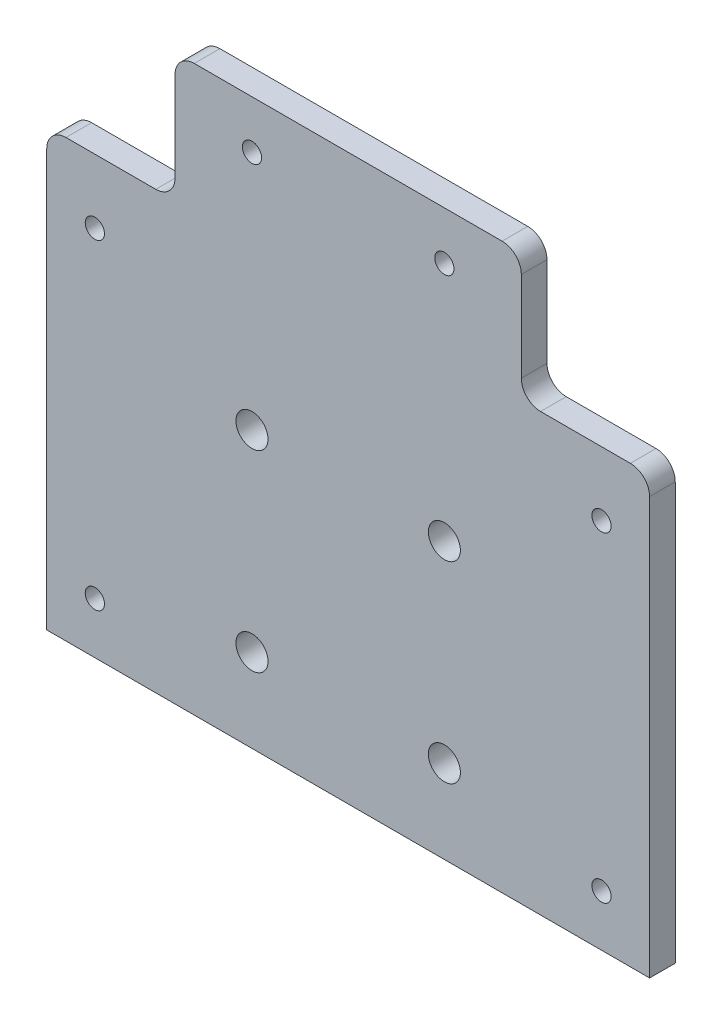
ISO-10303-21;
HEADER;
FILE_DESCRIPTION(('STEP AP214'),'2;1');
FILE_NAME('part.step','',(''),(''),'','','');
FILE_SCHEMA(('AUTOMOTIVE_DESIGN { 1 0 10303 214 1 1 1 1 }'));
ENDSEC;
DATA;
#1=APPLICATION_CONTEXT('core data for automotive mechanical design processes');
#2=APPLICATION_PROTOCOL_DEFINITION('international standard','automotive_design',2000,#1);
#3=PRODUCT_CONTEXT('',#1,'mechanical');
#4=PRODUCT('Part','Part','',(#3));
#5=PRODUCT_RELATED_PRODUCT_CATEGORY('part','',(#4));
#6=PRODUCT_DEFINITION_FORMATION('','',#4);
#7=PRODUCT_DEFINITION_CONTEXT('part definition',#1,'design');
#8=PRODUCT_DEFINITION('design','',#6,#7);
#9=PRODUCT_DEFINITION_SHAPE('','',#8);
#10=(LENGTH_UNIT() NAMED_UNIT(*) SI_UNIT(.MILLI.,.METRE.));
#11=(NAMED_UNIT(*) PLANE_ANGLE_UNIT() SI_UNIT($,.RADIAN.));
#12=(NAMED_UNIT(*) SI_UNIT($,.STERADIAN.) SOLID_ANGLE_UNIT());
#13=UNCERTAINTY_MEASURE_WITH_UNIT(LENGTH_MEASURE(1.E-05),#10,'distance_accuracy_value','');
#14=(GEOMETRIC_REPRESENTATION_CONTEXT(3) GLOBAL_UNCERTAINTY_ASSIGNED_CONTEXT((#13)) GLOBAL_UNIT_ASSIGNED_CONTEXT((#10,
#11,#12)) REPRESENTATION_CONTEXT('',''));
#15=CARTESIAN_POINT('',(0.,0.,0.));
#16=DIRECTION('',(0.,0.,1.));
#17=DIRECTION('',(1.,0.,0.));
#18=AXIS2_PLACEMENT_3D('',#15,#16,#17);
#19=CARTESIAN_POINT('',(47.,44.,4.));
#20=DIRECTION('',(-1.,0.,0.));
#21=DIRECTION('',(0.,-1.,0.));
#22=AXIS2_PLACEMENT_3D('',#19,#20,#21);
#23=PLANE('',#22);
#24=DIRECTION('',(0.,1.,0.));
#25=VECTOR('',#24,1.);
#26=CARTESIAN_POINT('',(47.,44.,0.));
#27=LINE('',#26,#25);
#28=CARTESIAN_POINT('',(47.,-44.,0.));
#29=VERTEX_POINT('',#28);
#30=CARTESIAN_POINT('',(47.,21.,0.));
#31=VERTEX_POINT('',#30);
#32=EDGE_CURVE('E172',#29,#31,#27,.T.);
#33=ORIENTED_EDGE('',*,*,#32,.T.);
#34=DIRECTION('',(0.,0.,1.));
#35=VECTOR('',#34,1.);
#36=CARTESIAN_POINT('',(47.,21.,4.));
#37=LINE('',#36,#35);
#38=CARTESIAN_POINT('',(47.,21.,4.));
#39=VERTEX_POINT('',#38);
#40=EDGE_CURVE('E160',#31,#39,#37,.T.);
#41=ORIENTED_EDGE('',*,*,#40,.T.);
#42=DIRECTION('',(0.,1.,0.));
#43=VECTOR('',#42,1.);
#44=CARTESIAN_POINT('',(47.,44.,4.));
#45=LINE('',#44,#43);
#46=CARTESIAN_POINT('',(47.,-44.,4.));
#47=VERTEX_POINT('',#46);
#48=EDGE_CURVE('E185',#47,#39,#45,.T.);
#49=ORIENTED_EDGE('',*,*,#48,.F.);
#50=DIRECTION('',(0.,0.,-1.));
#51=VECTOR('',#50,1.);
#52=CARTESIAN_POINT('',(47.,-44.,4.));
#53=LINE('',#52,#51);
#54=EDGE_CURVE('E161',#47,#29,#53,.T.);
#55=ORIENTED_EDGE('',*,*,#54,.T.);
#56=EDGE_LOOP('',(#33,#41,#49,#55));
#57=FACE_BOUND('',#56,.T.);
#58=ADVANCED_FACE('F39',(#57),#23,.F.);
#59=CARTESIAN_POINT('',(-47.,44.,4.));
#60=DIRECTION('',(0.,-1.,0.));
#61=DIRECTION('',(0.,0.,-1.));
#62=AXIS2_PLACEMENT_3D('',#59,#60,#61);
#63=PLANE('',#62);
#64=DIRECTION('',(-1.,0.,0.));
#65=VECTOR('',#64,1.);
#66=CARTESIAN_POINT('',(-47.,44.,0.));
#67=LINE('',#66,#65);
#68=CARTESIAN_POINT('',(24.,44.,0.));
#69=VERTEX_POINT('',#68);
#70=CARTESIAN_POINT('',(-24.,44.,0.));
#71=VERTEX_POINT('',#70);
#72=EDGE_CURVE('E176',#69,#71,#67,.T.);
#73=ORIENTED_EDGE('',*,*,#72,.T.);
#74=DIRECTION('',(0.,0.,1.));
#75=VECTOR('',#74,1.);
#76=CARTESIAN_POINT('',(-24.,44.,4.));
#77=LINE('',#76,#75);
#78=CARTESIAN_POINT('',(-24.,44.,4.));
#79=VERTEX_POINT('',#78);
#80=EDGE_CURVE('E232',#71,#79,#77,.T.);
#81=ORIENTED_EDGE('',*,*,#80,.T.);
#82=DIRECTION('',(-1.,0.,0.));
#83=VECTOR('',#82,1.);
#84=CARTESIAN_POINT('',(-47.,44.,4.));
#85=LINE('',#84,#83);
#86=CARTESIAN_POINT('',(24.,44.,4.));
#87=VERTEX_POINT('',#86);
#88=EDGE_CURVE('E151',#87,#79,#85,.T.);
#89=ORIENTED_EDGE('',*,*,#88,.F.);
#90=DIRECTION('',(0.,0.,1.));
#91=VECTOR('',#90,1.);
#92=CARTESIAN_POINT('',(24.,44.,4.));
#93=LINE('',#92,#91);
#94=EDGE_CURVE('E229',#87,#69,#93,.F.);
#95=ORIENTED_EDGE('',*,*,#94,.T.);
#96=EDGE_LOOP('',(#73,#81,#89,#95));
#97=FACE_BOUND('',#96,.T.);
#98=ADVANCED_FACE('F310',(#97),#63,.F.);
#99=CARTESIAN_POINT('',(-47.,44.,4.));
#100=DIRECTION('',(1.,0.,0.));
#101=DIRECTION('',(0.,1.,0.));
#102=AXIS2_PLACEMENT_3D('',#99,#100,#101);
#103=PLANE('',#102);
#104=DIRECTION('',(0.,-1.,0.));
#105=VECTOR('',#104,1.);
#106=CARTESIAN_POINT('',(-47.,44.,4.));
#107=LINE('',#106,#105);
#108=CARTESIAN_POINT('',(-47.,21.,4.));
#109=VERTEX_POINT('',#108);
#110=CARTESIAN_POINT('',(-47.,-44.,4.));
#111=VERTEX_POINT('',#110);
#112=EDGE_CURVE('E141',#109,#111,#107,.T.);
#113=ORIENTED_EDGE('',*,*,#112,.F.);
#114=DIRECTION('',(0.,0.,1.));
#115=VECTOR('',#114,1.);
#116=CARTESIAN_POINT('',(-47.,21.,4.));
#117=LINE('',#116,#115);
#118=CARTESIAN_POINT('',(-47.,21.,0.));
#119=VERTEX_POINT('',#118);
#120=EDGE_CURVE('E55',#109,#119,#117,.F.);
#121=ORIENTED_EDGE('',*,*,#120,.T.);
#122=DIRECTION('',(0.,-1.,0.));
#123=VECTOR('',#122,1.);
#124=CARTESIAN_POINT('',(-47.,44.,0.));
#125=LINE('',#124,#123);
#126=CARTESIAN_POINT('',(-47.,-44.,0.));
#127=VERTEX_POINT('',#126);
#128=EDGE_CURVE('E156',#119,#127,#125,.T.);
#129=ORIENTED_EDGE('',*,*,#128,.T.);
#130=DIRECTION('',(0.,0.,-1.));
#131=VECTOR('',#130,1.);
#132=CARTESIAN_POINT('',(-47.,-44.,4.));
#133=LINE('',#132,#131);
#134=EDGE_CURVE('E154',#111,#127,#133,.T.);
#135=ORIENTED_EDGE('',*,*,#134,.F.);
#136=EDGE_LOOP('',(#113,#121,#129,#135));
#137=FACE_BOUND('',#136,.T.);
#138=ADVANCED_FACE('F155',(#137),#103,.F.);
#139=CARTESIAN_POINT('',(-47.,-44.,4.));
#140=DIRECTION('',(0.,1.,0.));
#141=DIRECTION('',(0.,0.,1.));
#142=AXIS2_PLACEMENT_3D('',#139,#140,#141);
#143=PLANE('',#142);
#144=DIRECTION('',(1.,0.,0.));
#145=VECTOR('',#144,1.);
#146=CARTESIAN_POINT('',(-47.,-44.,0.));
#147=LINE('',#146,#145);
#148=EDGE_CURVE('E183',#127,#29,#147,.T.);
#149=ORIENTED_EDGE('',*,*,#148,.T.);
#150=ORIENTED_EDGE('',*,*,#54,.F.);
#151=DIRECTION('',(1.,0.,0.));
#152=VECTOR('',#151,1.);
#153=CARTESIAN_POINT('',(-47.,-44.,4.));
#154=LINE('',#153,#152);
#155=EDGE_CURVE('E146',#111,#47,#154,.T.);
#156=ORIENTED_EDGE('',*,*,#155,.F.);
#157=ORIENTED_EDGE('',*,*,#134,.T.);
#158=EDGE_LOOP('',(#149,#150,#156,#157));
#159=FACE_BOUND('',#158,.T.);
#160=ADVANCED_FACE('F163',(#159),#143,.F.);
#161=CARTESIAN_POINT('',(0.,0.,4.));
#162=DIRECTION('',(0.,0.,1.));
#163=DIRECTION('',(1.,0.,0.));
#164=AXIS2_PLACEMENT_3D('',#161,#162,#163);
#165=PLANE('',#164);
#166=CARTESIAN_POINT('',(39.5,14.,4.));
#167=DIRECTION('',(0.,0.,1.));
#168=DIRECTION('',(1.,0.,0.));
#169=AXIS2_PLACEMENT_3D('',#166,#167,#168);
#170=CIRCLE('',#169,1.5);
#171=CARTESIAN_POINT('',(41.,14.,4.));
#172=VERTEX_POINT('',#171);
#173=EDGE_CURVE('E431',#172,#172,#170,.T.);
#174=ORIENTED_EDGE('',*,*,#173,.F.);
#175=EDGE_LOOP('',(#174));
#176=FACE_BOUND('',#175,.T.);
#177=CARTESIAN_POINT('',(39.5,-36.,4.));
#178=DIRECTION('',(0.,0.,1.));
#179=DIRECTION('',(1.,0.,0.));
#180=AXIS2_PLACEMENT_3D('',#177,#178,#179);
#181=CIRCLE('',#180,1.5);
#182=CARTESIAN_POINT('',(41.,-36.,4.));
#183=VERTEX_POINT('',#182);
#184=EDGE_CURVE('E439',#183,#183,#181,.T.);
#185=ORIENTED_EDGE('',*,*,#184,.F.);
#186=EDGE_LOOP('',(#185));
#187=FACE_BOUND('',#186,.T.);
#188=CARTESIAN_POINT('',(15.,36.5,4.));
#189=DIRECTION('',(0.,0.,1.));
#190=DIRECTION('',(-1.,0.,0.));
#191=AXIS2_PLACEMENT_3D('',#188,#189,#190);
#192=CIRCLE('',#191,1.5);
#193=CARTESIAN_POINT('',(13.5,36.5,4.));
#194=VERTEX_POINT('',#193);
#195=EDGE_CURVE('E447',#194,#194,#192,.T.);
#196=ORIENTED_EDGE('',*,*,#195,.F.);
#197=EDGE_LOOP('',(#196));
#198=FACE_BOUND('',#197,.T.);
#199=CARTESIAN_POINT('',(-39.5,-36.,4.));
#200=DIRECTION('',(0.,0.,1.));
#201=DIRECTION('',(-1.,0.,0.));
#202=AXIS2_PLACEMENT_3D('',#199,#200,#201);
#203=CIRCLE('',#202,1.5);
#204=CARTESIAN_POINT('',(-41.,-36.,4.));
#205=VERTEX_POINT('',#204);
#206=EDGE_CURVE('E423',#205,#205,#203,.T.);
#207=ORIENTED_EDGE('',*,*,#206,.F.);
#208=EDGE_LOOP('',(#207));
#209=FACE_BOUND('',#208,.T.);
#210=CARTESIAN_POINT('',(-39.5,14.,4.));
#211=DIRECTION('',(0.,0.,1.));
#212=DIRECTION('',(-1.,0.,0.));
#213=AXIS2_PLACEMENT_3D('',#210,#211,#212);
#214=CIRCLE('',#213,1.5);
#215=CARTESIAN_POINT('',(-41.,14.,4.));
#216=VERTEX_POINT('',#215);
#217=EDGE_CURVE('E418',#216,#216,#214,.T.);
#218=ORIENTED_EDGE('',*,*,#217,.F.);
#219=EDGE_LOOP('',(#218));
#220=FACE_BOUND('',#219,.T.);
#221=CARTESIAN_POINT('',(-15.,36.5,4.));
#222=DIRECTION('',(0.,0.,1.));
#223=DIRECTION('',(1.,0.,0.));
#224=AXIS2_PLACEMENT_3D('',#221,#222,#223);
#225=CIRCLE('',#224,1.5);
#226=CARTESIAN_POINT('',(-13.5,36.5,4.));
#227=VERTEX_POINT('',#226);
#228=EDGE_CURVE('E430',#227,#227,#225,.T.);
#229=ORIENTED_EDGE('',*,*,#228,.F.);
#230=EDGE_LOOP('',(#229));
#231=FACE_BOUND('',#230,.T.);
#232=CARTESIAN_POINT('',(-15.,-31.,4.));
#233=DIRECTION('',(0.,0.,1.));
#234=DIRECTION('',(1.,0.,0.));
#235=AXIS2_PLACEMENT_3D('',#232,#233,#234);
#236=CIRCLE('',#235,2.5);
#237=CARTESIAN_POINT('',(-12.5,-31.,4.));
#238=VERTEX_POINT('',#237);
#239=EDGE_CURVE('E462',#238,#238,#236,.T.);
#240=ORIENTED_EDGE('',*,*,#239,.F.);
#241=EDGE_LOOP('',(#240));
#242=FACE_BOUND('',#241,.T.);
#243=CARTESIAN_POINT('',(15.,-31.,4.));
#244=DIRECTION('',(0.,0.,1.));
#245=DIRECTION('',(1.,0.,0.));
#246=AXIS2_PLACEMENT_3D('',#243,#244,#245);
#247=CIRCLE('',#246,2.49999999999999);
#248=CARTESIAN_POINT('',(17.5,-31.,4.));
#249=VERTEX_POINT('',#248);
#250=EDGE_CURVE('E479',#249,#249,#247,.T.);
#251=ORIENTED_EDGE('',*,*,#250,.F.);
#252=EDGE_LOOP('',(#251));
#253=FACE_BOUND('',#252,.T.);
#254=CARTESIAN_POINT('',(15.,-1.00000000000001,4.));
#255=DIRECTION('',(0.,0.,1.));
#256=DIRECTION('',(1.,0.,0.));
#257=AXIS2_PLACEMENT_3D('',#254,#255,#256);
#258=CIRCLE('',#257,2.49999999999999);
#259=CARTESIAN_POINT('',(17.5,-1.00000000000001,4.));
#260=VERTEX_POINT('',#259);
#261=EDGE_CURVE('E471',#260,#260,#258,.T.);
#262=ORIENTED_EDGE('',*,*,#261,.F.);
#263=EDGE_LOOP('',(#262));
#264=FACE_BOUND('',#263,.T.);
#265=CARTESIAN_POINT('',(-15.,-1.00000000000001,4.));
#266=DIRECTION('',(0.,0.,1.));
#267=DIRECTION('',(1.,0.,0.));
#268=AXIS2_PLACEMENT_3D('',#265,#266,#267);
#269=CIRCLE('',#268,2.5);
#270=CARTESIAN_POINT('',(-12.5,-1.00000000000001,4.));
#271=VERTEX_POINT('',#270);
#272=EDGE_CURVE('E470',#271,#271,#269,.T.);
#273=ORIENTED_EDGE('',*,*,#272,.F.);
#274=EDGE_LOOP('',(#273));
#275=FACE_BOUND('',#274,.T.);
#276=ORIENTED_EDGE('',*,*,#48,.T.);
#277=CARTESIAN_POINT('',(44.,21.,4.));
#278=DIRECTION('',(0.,0.,1.));
#279=DIRECTION('',(1.,0.,0.));
#280=AXIS2_PLACEMENT_3D('',#277,#278,#279);
#281=CIRCLE('',#280,3.);
#282=CARTESIAN_POINT('',(44.,24.,4.));
#283=VERTEX_POINT('',#282);
#284=EDGE_CURVE('E198',#39,#283,#281,.T.);
#285=ORIENTED_EDGE('',*,*,#284,.T.);
#286=DIRECTION('',(1.,0.,0.));
#287=VECTOR('',#286,1.);
#288=CARTESIAN_POINT('',(47.,24.,4.));
#289=LINE('',#288,#287);
#290=CARTESIAN_POINT('',(30.,24.,4.));
#291=VERTEX_POINT('',#290);
#292=EDGE_CURVE('E293',#291,#283,#289,.T.);
#293=ORIENTED_EDGE('',*,*,#292,.F.);
#294=CARTESIAN_POINT('',(30.,27.,4.));
#295=DIRECTION('',(0.,0.,1.));
#296=DIRECTION('',(1.,0.,0.));
#297=AXIS2_PLACEMENT_3D('',#294,#295,#296);
#298=CIRCLE('',#297,3.);
#299=CARTESIAN_POINT('',(27.,27.,4.));
#300=VERTEX_POINT('',#299);
#301=EDGE_CURVE('E249',#291,#300,#298,.F.);
#302=ORIENTED_EDGE('',*,*,#301,.T.);
#303=DIRECTION('',(0.,-1.,0.));
#304=VECTOR('',#303,1.);
#305=CARTESIAN_POINT('',(27.,44.,4.));
#306=LINE('',#305,#304);
#307=CARTESIAN_POINT('',(27.,41.,4.));
#308=VERTEX_POINT('',#307);
#309=EDGE_CURVE('E296',#308,#300,#306,.T.);
#310=ORIENTED_EDGE('',*,*,#309,.F.);
#311=CARTESIAN_POINT('',(24.,41.,4.));
#312=DIRECTION('',(0.,0.,1.));
#313=DIRECTION('',(1.,0.,0.));
#314=AXIS2_PLACEMENT_3D('',#311,#312,#313);
#315=CIRCLE('',#314,3.);
#316=EDGE_CURVE('E190',#308,#87,#315,.T.);
#317=ORIENTED_EDGE('',*,*,#316,.T.);
#318=ORIENTED_EDGE('',*,*,#88,.T.);
#319=CARTESIAN_POINT('',(-24.,41.,4.));
#320=DIRECTION('',(0.,0.,1.));
#321=DIRECTION('',(1.,0.,0.));
#322=AXIS2_PLACEMENT_3D('',#319,#320,#321);
#323=CIRCLE('',#322,3.);
#324=CARTESIAN_POINT('',(-27.,41.,4.));
#325=VERTEX_POINT('',#324);
#326=EDGE_CURVE('E193',#79,#325,#323,.T.);
#327=ORIENTED_EDGE('',*,*,#326,.T.);
#328=DIRECTION('',(0.,1.,0.));
#329=VECTOR('',#328,1.);
#330=CARTESIAN_POINT('',(-27.,44.,4.));
#331=LINE('',#330,#329);
#332=CARTESIAN_POINT('',(-27.,27.,4.));
#333=VERTEX_POINT('',#332);
#334=EDGE_CURVE('E259',#333,#325,#331,.T.);
#335=ORIENTED_EDGE('',*,*,#334,.F.);
#336=CARTESIAN_POINT('',(-30.,27.,4.));
#337=DIRECTION('',(0.,0.,1.));
#338=DIRECTION('',(1.,0.,0.));
#339=AXIS2_PLACEMENT_3D('',#336,#337,#338);
#340=CIRCLE('',#339,3.);
#341=CARTESIAN_POINT('',(-30.,24.,4.));
#342=VERTEX_POINT('',#341);
#343=EDGE_CURVE('E48',#333,#342,#340,.F.);
#344=ORIENTED_EDGE('',*,*,#343,.T.);
#345=DIRECTION('',(1.,0.,0.));
#346=VECTOR('',#345,1.);
#347=CARTESIAN_POINT('',(-47.,24.,4.));
#348=LINE('',#347,#346);
#349=CARTESIAN_POINT('',(-44.,24.,4.));
#350=VERTEX_POINT('',#349);
#351=EDGE_CURVE('E257',#350,#342,#348,.T.);
#352=ORIENTED_EDGE('',*,*,#351,.F.);
#353=CARTESIAN_POINT('',(-44.,21.,4.));
#354=DIRECTION('',(0.,0.,1.));
#355=DIRECTION('',(1.,0.,0.));
#356=AXIS2_PLACEMENT_3D('',#353,#354,#355);
#357=CIRCLE('',#356,3.);
#358=EDGE_CURVE('E149',#350,#109,#357,.T.);
#359=ORIENTED_EDGE('',*,*,#358,.T.);
#360=ORIENTED_EDGE('',*,*,#112,.T.);
#361=ORIENTED_EDGE('',*,*,#155,.T.);
#362=EDGE_LOOP('',(#276,#285,#293,#302,#310,#317,#318,#327,#335,#344,#352,#359,#360,#361));
#363=FACE_BOUND('',#362,.T.);
#364=ADVANCED_FACE('F144',(#176,#187,#198,#209,#220,#231,#242,#253,#264,#275,#363),#165,.T.);
#365=CARTESIAN_POINT('',(0.,0.,0.));
#366=DIRECTION('',(0.,0.,1.));
#367=DIRECTION('',(1.,0.,0.));
#368=AXIS2_PLACEMENT_3D('',#365,#366,#367);
#369=PLANE('',#368);
#370=CARTESIAN_POINT('',(39.5,14.,0.));
#371=DIRECTION('',(0.,0.,1.));
#372=DIRECTION('',(1.,0.,0.));
#373=AXIS2_PLACEMENT_3D('',#370,#371,#372);
#374=CIRCLE('',#373,1.5);
#375=CARTESIAN_POINT('',(41.,14.,0.));
#376=VERTEX_POINT('',#375);
#377=EDGE_CURVE('E426',#376,#376,#374,.T.);
#378=ORIENTED_EDGE('',*,*,#377,.T.);
#379=EDGE_LOOP('',(#378));
#380=FACE_BOUND('',#379,.T.);
#381=CARTESIAN_POINT('',(39.5,-36.,0.));
#382=DIRECTION('',(0.,0.,1.));
#383=DIRECTION('',(1.,0.,0.));
#384=AXIS2_PLACEMENT_3D('',#381,#382,#383);
#385=CIRCLE('',#384,1.5);
#386=CARTESIAN_POINT('',(41.,-36.,0.));
#387=VERTEX_POINT('',#386);
#388=EDGE_CURVE('E435',#387,#387,#385,.T.);
#389=ORIENTED_EDGE('',*,*,#388,.T.);
#390=EDGE_LOOP('',(#389));
#391=FACE_BOUND('',#390,.T.);
#392=CARTESIAN_POINT('',(15.,36.5,0.));
#393=DIRECTION('',(0.,0.,1.));
#394=DIRECTION('',(-1.,0.,0.));
#395=AXIS2_PLACEMENT_3D('',#392,#393,#394);
#396=CIRCLE('',#395,1.5);
#397=CARTESIAN_POINT('',(13.5,36.5,0.));
#398=VERTEX_POINT('',#397);
#399=EDGE_CURVE('E443',#398,#398,#396,.T.);
#400=ORIENTED_EDGE('',*,*,#399,.T.);
#401=EDGE_LOOP('',(#400));
#402=FACE_BOUND('',#401,.T.);
#403=CARTESIAN_POINT('',(-39.5,-36.,0.));
#404=DIRECTION('',(0.,0.,1.));
#405=DIRECTION('',(-1.,0.,0.));
#406=AXIS2_PLACEMENT_3D('',#403,#404,#405);
#407=CIRCLE('',#406,1.5);
#408=CARTESIAN_POINT('',(-41.,-36.,0.));
#409=VERTEX_POINT('',#408);
#410=EDGE_CURVE('E451',#409,#409,#407,.T.);
#411=ORIENTED_EDGE('',*,*,#410,.T.);
#412=EDGE_LOOP('',(#411));
#413=FACE_BOUND('',#412,.T.);
#414=CARTESIAN_POINT('',(-39.5,14.,0.));
#415=DIRECTION('',(0.,0.,1.));
#416=DIRECTION('',(-1.,0.,0.));
#417=AXIS2_PLACEMENT_3D('',#414,#415,#416);
#418=CIRCLE('',#417,1.5);
#419=CARTESIAN_POINT('',(-41.,14.,0.));
#420=VERTEX_POINT('',#419);
#421=EDGE_CURVE('E415',#420,#420,#418,.T.);
#422=ORIENTED_EDGE('',*,*,#421,.T.);
#423=EDGE_LOOP('',(#422));
#424=FACE_BOUND('',#423,.T.);
#425=CARTESIAN_POINT('',(-15.,36.5,0.));
#426=DIRECTION('',(0.,0.,1.));
#427=DIRECTION('',(1.,0.,0.));
#428=AXIS2_PLACEMENT_3D('',#425,#426,#427);
#429=CIRCLE('',#428,1.5);
#430=CARTESIAN_POINT('',(-13.5,36.5,0.));
#431=VERTEX_POINT('',#430);
#432=EDGE_CURVE('E458',#431,#431,#429,.T.);
#433=ORIENTED_EDGE('',*,*,#432,.T.);
#434=EDGE_LOOP('',(#433));
#435=FACE_BOUND('',#434,.T.);
#436=CARTESIAN_POINT('',(-15.,-31.,0.));
#437=DIRECTION('',(0.,0.,1.));
#438=DIRECTION('',(1.,0.,0.));
#439=AXIS2_PLACEMENT_3D('',#436,#437,#438);
#440=CIRCLE('',#439,2.5);
#441=CARTESIAN_POINT('',(-12.5,-31.,0.));
#442=VERTEX_POINT('',#441);
#443=EDGE_CURVE('E483',#442,#442,#440,.T.);
#444=ORIENTED_EDGE('',*,*,#443,.T.);
#445=EDGE_LOOP('',(#444));
#446=FACE_BOUND('',#445,.T.);
#447=CARTESIAN_POINT('',(15.,-31.,0.));
#448=DIRECTION('',(0.,0.,1.));
#449=DIRECTION('',(1.,0.,0.));
#450=AXIS2_PLACEMENT_3D('',#447,#448,#449);
#451=CIRCLE('',#450,2.49999999999999);
#452=CARTESIAN_POINT('',(17.5,-31.,0.));
#453=VERTEX_POINT('',#452);
#454=EDGE_CURVE('E475',#453,#453,#451,.T.);
#455=ORIENTED_EDGE('',*,*,#454,.T.);
#456=EDGE_LOOP('',(#455));
#457=FACE_BOUND('',#456,.T.);
#458=CARTESIAN_POINT('',(15.,-1.00000000000001,0.));
#459=DIRECTION('',(0.,0.,1.));
#460=DIRECTION('',(1.,0.,0.));
#461=AXIS2_PLACEMENT_3D('',#458,#459,#460);
#462=CIRCLE('',#461,2.49999999999999);
#463=CARTESIAN_POINT('',(17.5,-1.00000000000001,0.));
#464=VERTEX_POINT('',#463);
#465=EDGE_CURVE('E466',#464,#464,#462,.T.);
#466=ORIENTED_EDGE('',*,*,#465,.T.);
#467=EDGE_LOOP('',(#466));
#468=FACE_BOUND('',#467,.T.);
#469=CARTESIAN_POINT('',(-15.,-1.00000000000001,0.));
#470=DIRECTION('',(0.,0.,1.));
#471=DIRECTION('',(1.,0.,0.));
#472=AXIS2_PLACEMENT_3D('',#469,#470,#471);
#473=CIRCLE('',#472,2.5);
#474=CARTESIAN_POINT('',(-12.5,-1.00000000000001,0.));
#475=VERTEX_POINT('',#474);
#476=EDGE_CURVE('E299',#475,#475,#473,.T.);
#477=ORIENTED_EDGE('',*,*,#476,.T.);
#478=EDGE_LOOP('',(#477));
#479=FACE_BOUND('',#478,.T.);
#480=DIRECTION('',(1.,0.,0.));
#481=VECTOR('',#480,1.);
#482=CARTESIAN_POINT('',(47.,24.,0.));
#483=LINE('',#482,#481);
#484=CARTESIAN_POINT('',(30.,24.,0.));
#485=VERTEX_POINT('',#484);
#486=CARTESIAN_POINT('',(44.,24.,0.));
#487=VERTEX_POINT('',#486);
#488=EDGE_CURVE('E269',#485,#487,#483,.T.);
#489=ORIENTED_EDGE('',*,*,#488,.T.);
#490=CARTESIAN_POINT('',(44.,21.,0.));
#491=DIRECTION('',(0.,0.,1.));
#492=DIRECTION('',(1.,0.,0.));
#493=AXIS2_PLACEMENT_3D('',#490,#491,#492);
#494=CIRCLE('',#493,3.);
#495=EDGE_CURVE('E217',#487,#31,#494,.F.);
#496=ORIENTED_EDGE('',*,*,#495,.T.);
#497=ORIENTED_EDGE('',*,*,#32,.F.);
#498=ORIENTED_EDGE('',*,*,#148,.F.);
#499=ORIENTED_EDGE('',*,*,#128,.F.);
#500=CARTESIAN_POINT('',(-44.,21.,0.));
#501=DIRECTION('',(0.,0.,1.));
#502=DIRECTION('',(1.,0.,0.));
#503=AXIS2_PLACEMENT_3D('',#500,#501,#502);
#504=CIRCLE('',#503,3.);
#505=CARTESIAN_POINT('',(-44.,24.,0.));
#506=VERTEX_POINT('',#505);
#507=EDGE_CURVE('E214',#119,#506,#504,.F.);
#508=ORIENTED_EDGE('',*,*,#507,.T.);
#509=DIRECTION('',(1.,0.,0.));
#510=VECTOR('',#509,1.);
#511=CARTESIAN_POINT('',(-47.,24.,0.));
#512=LINE('',#511,#510);
#513=CARTESIAN_POINT('',(-30.,24.,0.));
#514=VERTEX_POINT('',#513);
#515=EDGE_CURVE('E278',#506,#514,#512,.T.);
#516=ORIENTED_EDGE('',*,*,#515,.T.);
#517=CARTESIAN_POINT('',(-30.,27.,0.));
#518=DIRECTION('',(0.,0.,1.));
#519=DIRECTION('',(1.,0.,0.));
#520=AXIS2_PLACEMENT_3D('',#517,#518,#519);
#521=CIRCLE('',#520,3.);
#522=CARTESIAN_POINT('',(-27.,27.,0.));
#523=VERTEX_POINT('',#522);
#524=EDGE_CURVE('E11',#514,#523,#521,.T.);
#525=ORIENTED_EDGE('',*,*,#524,.T.);
#526=DIRECTION('',(0.,1.,0.));
#527=VECTOR('',#526,1.);
#528=CARTESIAN_POINT('',(-27.,44.,0.));
#529=LINE('',#528,#527);
#530=CARTESIAN_POINT('',(-27.,41.,0.));
#531=VERTEX_POINT('',#530);
#532=EDGE_CURVE('E177',#523,#531,#529,.T.);
#533=ORIENTED_EDGE('',*,*,#532,.T.);
#534=CARTESIAN_POINT('',(-24.,41.,0.));
#535=DIRECTION('',(0.,0.,1.));
#536=DIRECTION('',(1.,0.,0.));
#537=AXIS2_PLACEMENT_3D('',#534,#535,#536);
#538=CIRCLE('',#537,3.);
#539=EDGE_CURVE('E211',#531,#71,#538,.F.);
#540=ORIENTED_EDGE('',*,*,#539,.T.);
#541=ORIENTED_EDGE('',*,*,#72,.F.);
#542=CARTESIAN_POINT('',(24.,41.,0.));
#543=DIRECTION('',(0.,0.,1.));
#544=DIRECTION('',(1.,0.,0.));
#545=AXIS2_PLACEMENT_3D('',#542,#543,#544);
#546=CIRCLE('',#545,3.);
#547=CARTESIAN_POINT('',(27.,41.,0.));
#548=VERTEX_POINT('',#547);
#549=EDGE_CURVE('E208',#69,#548,#546,.F.);
#550=ORIENTED_EDGE('',*,*,#549,.T.);
#551=DIRECTION('',(0.,-1.,0.));
#552=VECTOR('',#551,1.);
#553=CARTESIAN_POINT('',(27.,44.,0.));
#554=LINE('',#553,#552);
#555=CARTESIAN_POINT('',(27.,27.,0.));
#556=VERTEX_POINT('',#555);
#557=EDGE_CURVE('E290',#548,#556,#554,.T.);
#558=ORIENTED_EDGE('',*,*,#557,.T.);
#559=CARTESIAN_POINT('',(30.,27.,0.));
#560=DIRECTION('',(0.,0.,1.));
#561=DIRECTION('',(1.,0.,0.));
#562=AXIS2_PLACEMENT_3D('',#559,#560,#561);
#563=CIRCLE('',#562,3.);
#564=EDGE_CURVE('E252',#556,#485,#563,.T.);
#565=ORIENTED_EDGE('',*,*,#564,.T.);
#566=EDGE_LOOP('',(#489,#496,#497,#498,#499,#508,#516,#525,#533,#540,#541,#550,#558,#565));
#567=FACE_BOUND('',#566,.T.);
#568=ADVANCED_FACE('F276',(#380,#391,#402,#413,#424,#435,#446,#457,#468,#479,#567),#369,.F.);
#569=CARTESIAN_POINT('',(47.,24.,0.));
#570=DIRECTION('',(0.,-1.,0.));
#571=DIRECTION('',(1.,0.,0.));
#572=AXIS2_PLACEMENT_3D('',#569,#570,#571);
#573=PLANE('',#572);
#574=ORIENTED_EDGE('',*,*,#292,.T.);
#575=DIRECTION('',(0.,0.,1.));
#576=VECTOR('',#575,1.);
#577=CARTESIAN_POINT('',(44.,24.,0.));
#578=LINE('',#577,#576);
#579=EDGE_CURVE('E205',#283,#487,#578,.F.);
#580=ORIENTED_EDGE('',*,*,#579,.T.);
#581=ORIENTED_EDGE('',*,*,#488,.F.);
#582=DIRECTION('',(0.,0.,1.));
#583=VECTOR('',#582,1.);
#584=CARTESIAN_POINT('',(30.,24.,4.));
#585=LINE('',#584,#583);
#586=EDGE_CURVE('E201',#485,#291,#585,.T.);
#587=ORIENTED_EDGE('',*,*,#586,.T.);
#588=EDGE_LOOP('',(#574,#580,#581,#587));
#589=FACE_BOUND('',#588,.T.);
#590=ADVANCED_FACE('F325',(#589),#573,.F.);
#591=CARTESIAN_POINT('',(27.,44.,0.));
#592=DIRECTION('',(-1.,0.,0.));
#593=DIRECTION('',(0.,-1.,0.));
#594=AXIS2_PLACEMENT_3D('',#591,#592,#593);
#595=PLANE('',#594);
#596=ORIENTED_EDGE('',*,*,#557,.F.);
#597=DIRECTION('',(0.,0.,1.));
#598=VECTOR('',#597,1.);
#599=CARTESIAN_POINT('',(27.,41.,0.));
#600=LINE('',#599,#598);
#601=EDGE_CURVE('E245',#548,#308,#600,.T.);
#602=ORIENTED_EDGE('',*,*,#601,.T.);
#603=ORIENTED_EDGE('',*,*,#309,.T.);
#604=DIRECTION('',(0.,0.,1.));
#605=VECTOR('',#604,1.);
#606=CARTESIAN_POINT('',(27.,27.,0.));
#607=LINE('',#606,#605);
#608=EDGE_CURVE('E63',#300,#556,#607,.F.);
#609=ORIENTED_EDGE('',*,*,#608,.T.);
#610=EDGE_LOOP('',(#596,#602,#603,#609));
#611=FACE_BOUND('',#610,.T.);
#612=ADVANCED_FACE('F318',(#611),#595,.F.);
#613=CARTESIAN_POINT('',(-27.,44.,0.));
#614=DIRECTION('',(1.,0.,0.));
#615=DIRECTION('',(0.,1.,0.));
#616=AXIS2_PLACEMENT_3D('',#613,#614,#615);
#617=PLANE('',#616);
#618=ORIENTED_EDGE('',*,*,#334,.T.);
#619=DIRECTION('',(0.,0.,1.));
#620=VECTOR('',#619,1.);
#621=CARTESIAN_POINT('',(-27.,41.,0.));
#622=LINE('',#621,#620);
#623=EDGE_CURVE('E240',#325,#531,#622,.F.);
#624=ORIENTED_EDGE('',*,*,#623,.T.);
#625=ORIENTED_EDGE('',*,*,#532,.F.);
#626=DIRECTION('',(0.,0.,1.));
#627=VECTOR('',#626,1.);
#628=CARTESIAN_POINT('',(-27.,27.,4.));
#629=LINE('',#628,#627);
#630=EDGE_CURVE('E236',#523,#333,#629,.T.);
#631=ORIENTED_EDGE('',*,*,#630,.T.);
#632=EDGE_LOOP('',(#618,#624,#625,#631));
#633=FACE_BOUND('',#632,.T.);
#634=ADVANCED_FACE('F280',(#633),#617,.F.);
#635=CARTESIAN_POINT('',(-47.,24.,0.));
#636=DIRECTION('',(0.,-1.,0.));
#637=DIRECTION('',(0.,0.,-1.));
#638=AXIS2_PLACEMENT_3D('',#635,#636,#637);
#639=PLANE('',#638);
#640=ORIENTED_EDGE('',*,*,#515,.F.);
#641=DIRECTION('',(0.,0.,1.));
#642=VECTOR('',#641,1.);
#643=CARTESIAN_POINT('',(-44.,24.,0.));
#644=LINE('',#643,#642);
#645=EDGE_CURVE('E223',#506,#350,#644,.T.);
#646=ORIENTED_EDGE('',*,*,#645,.T.);
#647=ORIENTED_EDGE('',*,*,#351,.T.);
#648=DIRECTION('',(0.,0.,1.));
#649=VECTOR('',#648,1.);
#650=CARTESIAN_POINT('',(-30.,24.,0.));
#651=LINE('',#650,#649);
#652=EDGE_CURVE('E220',#342,#514,#651,.F.);
#653=ORIENTED_EDGE('',*,*,#652,.T.);
#654=EDGE_LOOP('',(#640,#646,#647,#653));
#655=FACE_BOUND('',#654,.T.);
#656=ADVANCED_FACE('F265',(#655),#639,.F.);
#657=CARTESIAN_POINT('',(44.,21.,4.));
#658=DIRECTION('',(0.,0.,1.));
#659=DIRECTION('',(1.,0.,0.));
#660=AXIS2_PLACEMENT_3D('',#657,#658,#659);
#661=CYLINDRICAL_SURFACE('',#660,3.);
#662=ORIENTED_EDGE('',*,*,#495,.F.);
#663=ORIENTED_EDGE('',*,*,#579,.F.);
#664=ORIENTED_EDGE('',*,*,#284,.F.);
#665=ORIENTED_EDGE('',*,*,#40,.F.);
#666=EDGE_LOOP('',(#662,#663,#664,#665));
#667=FACE_BOUND('',#666,.T.);
#668=ADVANCED_FACE('F331',(#667),#661,.T.);
#669=CARTESIAN_POINT('',(-44.,21.,0.));
#670=DIRECTION('',(0.,0.,1.));
#671=DIRECTION('',(1.,0.,0.));
#672=AXIS2_PLACEMENT_3D('',#669,#670,#671);
#673=CYLINDRICAL_SURFACE('',#672,3.);
#674=ORIENTED_EDGE('',*,*,#507,.F.);
#675=ORIENTED_EDGE('',*,*,#120,.F.);
#676=ORIENTED_EDGE('',*,*,#358,.F.);
#677=ORIENTED_EDGE('',*,*,#645,.F.);
#678=EDGE_LOOP('',(#674,#675,#676,#677));
#679=FACE_BOUND('',#678,.T.);
#680=ADVANCED_FACE('F335',(#679),#673,.T.);
#681=CARTESIAN_POINT('',(-24.,41.,4.));
#682=DIRECTION('',(0.,0.,1.));
#683=DIRECTION('',(1.,0.,0.));
#684=AXIS2_PLACEMENT_3D('',#681,#682,#683);
#685=CYLINDRICAL_SURFACE('',#684,3.);
#686=ORIENTED_EDGE('',*,*,#539,.F.);
#687=ORIENTED_EDGE('',*,*,#623,.F.);
#688=ORIENTED_EDGE('',*,*,#326,.F.);
#689=ORIENTED_EDGE('',*,*,#80,.F.);
#690=EDGE_LOOP('',(#686,#687,#688,#689));
#691=FACE_BOUND('',#690,.T.);
#692=ADVANCED_FACE('F337',(#691),#685,.T.);
#693=CARTESIAN_POINT('',(24.,41.,0.));
#694=DIRECTION('',(0.,0.,1.));
#695=DIRECTION('',(1.,0.,0.));
#696=AXIS2_PLACEMENT_3D('',#693,#694,#695);
#697=CYLINDRICAL_SURFACE('',#696,3.);
#698=ORIENTED_EDGE('',*,*,#549,.F.);
#699=ORIENTED_EDGE('',*,*,#94,.F.);
#700=ORIENTED_EDGE('',*,*,#316,.F.);
#701=ORIENTED_EDGE('',*,*,#601,.F.);
#702=EDGE_LOOP('',(#698,#699,#700,#701));
#703=FACE_BOUND('',#702,.T.);
#704=ADVANCED_FACE('F315',(#703),#697,.T.);
#705=CARTESIAN_POINT('',(30.,27.,0.));
#706=DIRECTION('',(0.,0.,-1.));
#707=DIRECTION('',(-1.,0.,0.));
#708=AXIS2_PLACEMENT_3D('',#705,#706,#707);
#709=CYLINDRICAL_SURFACE('',#708,3.);
#710=ORIENTED_EDGE('',*,*,#564,.F.);
#711=ORIENTED_EDGE('',*,*,#608,.F.);
#712=ORIENTED_EDGE('',*,*,#301,.F.);
#713=ORIENTED_EDGE('',*,*,#586,.F.);
#714=EDGE_LOOP('',(#710,#711,#712,#713));
#715=FACE_BOUND('',#714,.T.);
#716=ADVANCED_FACE('F322',(#715),#709,.F.);
#717=CARTESIAN_POINT('',(-30.,27.,0.));
#718=DIRECTION('',(0.,0.,-1.));
#719=DIRECTION('',(-1.,0.,0.));
#720=AXIS2_PLACEMENT_3D('',#717,#718,#719);
#721=CYLINDRICAL_SURFACE('',#720,3.);
#722=ORIENTED_EDGE('',*,*,#524,.F.);
#723=ORIENTED_EDGE('',*,*,#652,.F.);
#724=ORIENTED_EDGE('',*,*,#343,.F.);
#725=ORIENTED_EDGE('',*,*,#630,.F.);
#726=EDGE_LOOP('',(#722,#723,#724,#725));
#727=FACE_BOUND('',#726,.T.);
#728=ADVANCED_FACE('F41',(#727),#721,.F.);
#729=CARTESIAN_POINT('',(-15.,-1.00000000000001,0.));
#730=DIRECTION('',(0.,0.,1.));
#731=DIRECTION('',(1.,0.,0.));
#732=AXIS2_PLACEMENT_3D('',#729,#730,#731);
#733=CYLINDRICAL_SURFACE('',#732,2.5);
#734=ORIENTED_EDGE('',*,*,#476,.F.);
#735=EDGE_LOOP('',(#734));
#736=FACE_BOUND('',#735,.T.);
#737=ORIENTED_EDGE('',*,*,#272,.T.);
#738=EDGE_LOOP('',(#737));
#739=FACE_BOUND('',#738,.T.);
#740=ADVANCED_FACE('F371',(#736,#739),#733,.F.);
#741=CARTESIAN_POINT('',(15.,-1.00000000000001,0.));
#742=DIRECTION('',(0.,0.,1.));
#743=DIRECTION('',(1.,0.,0.));
#744=AXIS2_PLACEMENT_3D('',#741,#742,#743);
#745=CYLINDRICAL_SURFACE('',#744,2.49999999999999);
#746=ORIENTED_EDGE('',*,*,#465,.F.);
#747=EDGE_LOOP('',(#746));
#748=FACE_BOUND('',#747,.T.);
#749=ORIENTED_EDGE('',*,*,#261,.T.);
#750=EDGE_LOOP('',(#749));
#751=FACE_BOUND('',#750,.T.);
#752=ADVANCED_FACE('F374',(#748,#751),#745,.F.);
#753=CARTESIAN_POINT('',(15.,-31.,0.));
#754=DIRECTION('',(0.,0.,1.));
#755=DIRECTION('',(1.,0.,0.));
#756=AXIS2_PLACEMENT_3D('',#753,#754,#755);
#757=CYLINDRICAL_SURFACE('',#756,2.49999999999999);
#758=ORIENTED_EDGE('',*,*,#454,.F.);
#759=EDGE_LOOP('',(#758));
#760=FACE_BOUND('',#759,.T.);
#761=ORIENTED_EDGE('',*,*,#250,.T.);
#762=EDGE_LOOP('',(#761));
#763=FACE_BOUND('',#762,.T.);
#764=ADVANCED_FACE('F380',(#760,#763),#757,.F.);
#765=CARTESIAN_POINT('',(-15.,-31.,0.));
#766=DIRECTION('',(0.,0.,1.));
#767=DIRECTION('',(1.,0.,0.));
#768=AXIS2_PLACEMENT_3D('',#765,#766,#767);
#769=CYLINDRICAL_SURFACE('',#768,2.5);
#770=ORIENTED_EDGE('',*,*,#443,.F.);
#771=EDGE_LOOP('',(#770));
#772=FACE_BOUND('',#771,.T.);
#773=ORIENTED_EDGE('',*,*,#239,.T.);
#774=EDGE_LOOP('',(#773));
#775=FACE_BOUND('',#774,.T.);
#776=ADVANCED_FACE('F376',(#772,#775),#769,.F.);
#777=CARTESIAN_POINT('',(-15.,36.5,0.));
#778=DIRECTION('',(0.,0.,1.));
#779=DIRECTION('',(1.,0.,0.));
#780=AXIS2_PLACEMENT_3D('',#777,#778,#779);
#781=CYLINDRICAL_SURFACE('',#780,1.5);
#782=ORIENTED_EDGE('',*,*,#432,.F.);
#783=EDGE_LOOP('',(#782));
#784=FACE_BOUND('',#783,.T.);
#785=ORIENTED_EDGE('',*,*,#228,.T.);
#786=EDGE_LOOP('',(#785));
#787=FACE_BOUND('',#786,.T.);
#788=ADVANCED_FACE('F379',(#784,#787),#781,.F.);
#789=CARTESIAN_POINT('',(-39.5,14.,0.));
#790=DIRECTION('',(0.,0.,1.));
#791=DIRECTION('',(1.,0.,0.));
#792=AXIS2_PLACEMENT_3D('',#789,#790,#791);
#793=CYLINDRICAL_SURFACE('',#792,1.5);
#794=ORIENTED_EDGE('',*,*,#421,.F.);
#795=EDGE_LOOP('',(#794));
#796=FACE_BOUND('',#795,.T.);
#797=ORIENTED_EDGE('',*,*,#217,.T.);
#798=EDGE_LOOP('',(#797));
#799=FACE_BOUND('',#798,.T.);
#800=ADVANCED_FACE('F390',(#796,#799),#793,.F.);
#801=CARTESIAN_POINT('',(-39.5,-36.,0.));
#802=DIRECTION('',(0.,0.,1.));
#803=DIRECTION('',(1.,0.,0.));
#804=AXIS2_PLACEMENT_3D('',#801,#802,#803);
#805=CYLINDRICAL_SURFACE('',#804,1.5);
#806=ORIENTED_EDGE('',*,*,#410,.F.);
#807=EDGE_LOOP('',(#806));
#808=FACE_BOUND('',#807,.T.);
#809=ORIENTED_EDGE('',*,*,#206,.T.);
#810=EDGE_LOOP('',(#809));
#811=FACE_BOUND('',#810,.T.);
#812=ADVANCED_FACE('F392',(#808,#811),#805,.F.);
#813=CARTESIAN_POINT('',(15.,36.5,0.));
#814=DIRECTION('',(0.,0.,1.));
#815=DIRECTION('',(1.,0.,0.));
#816=AXIS2_PLACEMENT_3D('',#813,#814,#815);
#817=CYLINDRICAL_SURFACE('',#816,1.5);
#818=ORIENTED_EDGE('',*,*,#399,.F.);
#819=EDGE_LOOP('',(#818));
#820=FACE_BOUND('',#819,.T.);
#821=ORIENTED_EDGE('',*,*,#195,.T.);
#822=EDGE_LOOP('',(#821));
#823=FACE_BOUND('',#822,.T.);
#824=ADVANCED_FACE('F395',(#820,#823),#817,.F.);
#825=CARTESIAN_POINT('',(39.5,-36.,0.));
#826=DIRECTION('',(0.,0.,1.));
#827=DIRECTION('',(1.,0.,0.));
#828=AXIS2_PLACEMENT_3D('',#825,#826,#827);
#829=CYLINDRICAL_SURFACE('',#828,1.5);
#830=ORIENTED_EDGE('',*,*,#388,.F.);
#831=EDGE_LOOP('',(#830));
#832=FACE_BOUND('',#831,.T.);
#833=ORIENTED_EDGE('',*,*,#184,.T.);
#834=EDGE_LOOP('',(#833));
#835=FACE_BOUND('',#834,.T.);
#836=ADVANCED_FACE('F399',(#832,#835),#829,.F.);
#837=CARTESIAN_POINT('',(39.5,14.,0.));
#838=DIRECTION('',(0.,0.,1.));
#839=DIRECTION('',(1.,0.,0.));
#840=AXIS2_PLACEMENT_3D('',#837,#838,#839);
#841=CYLINDRICAL_SURFACE('',#840,1.5);
#842=ORIENTED_EDGE('',*,*,#377,.F.);
#843=EDGE_LOOP('',(#842));
#844=FACE_BOUND('',#843,.T.);
#845=ORIENTED_EDGE('',*,*,#173,.T.);
#846=EDGE_LOOP('',(#845));
#847=FACE_BOUND('',#846,.T.);
#848=ADVANCED_FACE('F403',(#844,#847),#841,.F.);
#849=CLOSED_SHELL('',(#58,#98,#138,#160,#364,#568,#590,#612,#634,#656,#668,#680,#692,#704,#716,
#728,#740,#752,#764,#776,#788,#800,#812,#824,#836,#848));
#850=MANIFOLD_SOLID_BREP('B2',#849);
#851=ADVANCED_BREP_SHAPE_REPRESENTATION('',(#18,#850),#14);
#852=SHAPE_DEFINITION_REPRESENTATION(#9,#851);
ENDSEC;
END-ISO-10303-21;
